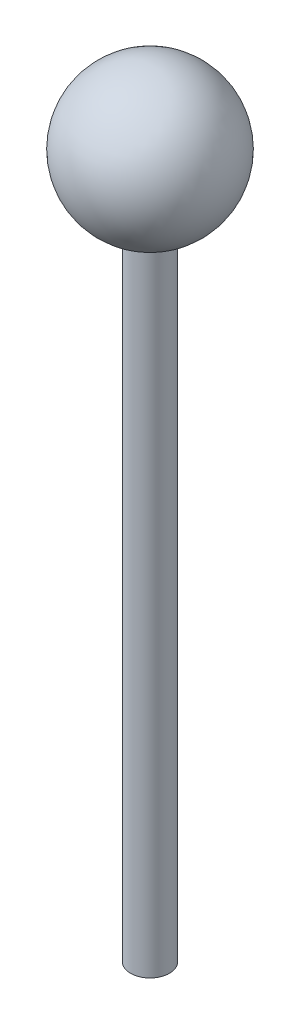
ISO-10303-21;
HEADER;
FILE_DESCRIPTION(('STEP AP214'),'2;1');
FILE_NAME('part.step','',(''),(''),'','','');
FILE_SCHEMA(('AUTOMOTIVE_DESIGN { 1 0 10303 214 1 1 1 1 }'));
ENDSEC;
DATA;
#1=APPLICATION_CONTEXT('core data for automotive mechanical design processes');
#2=APPLICATION_PROTOCOL_DEFINITION('international standard','automotive_design',2000,#1);
#3=PRODUCT_CONTEXT('',#1,'mechanical');
#4=PRODUCT('Part','Part','',(#3));
#5=PRODUCT_RELATED_PRODUCT_CATEGORY('part','',(#4));
#6=PRODUCT_DEFINITION_FORMATION('','',#4);
#7=PRODUCT_DEFINITION_CONTEXT('part definition',#1,'design');
#8=PRODUCT_DEFINITION('design','',#6,#7);
#9=PRODUCT_DEFINITION_SHAPE('','',#8);
#10=(LENGTH_UNIT() NAMED_UNIT(*) SI_UNIT(.MILLI.,.METRE.));
#11=(NAMED_UNIT(*) PLANE_ANGLE_UNIT() SI_UNIT($,.RADIAN.));
#12=(NAMED_UNIT(*) SI_UNIT($,.STERADIAN.) SOLID_ANGLE_UNIT());
#13=UNCERTAINTY_MEASURE_WITH_UNIT(LENGTH_MEASURE(1.E-05),#10,'distance_accuracy_value','');
#14=(GEOMETRIC_REPRESENTATION_CONTEXT(3) GLOBAL_UNCERTAINTY_ASSIGNED_CONTEXT((#13)) GLOBAL_UNIT_ASSIGNED_CONTEXT((#10,
#11,#12)) REPRESENTATION_CONTEXT('',''));
#15=CARTESIAN_POINT('',(0.,0.,0.));
#16=DIRECTION('',(0.,0.,1.));
#17=DIRECTION('',(1.,0.,0.));
#18=AXIS2_PLACEMENT_3D('',#15,#16,#17);
#19=CARTESIAN_POINT('',(0.,65.,0.));
#20=DIRECTION('',(0.,-1.,0.));
#21=DIRECTION('',(0.,0.,-1.));
#22=AXIS2_PLACEMENT_3D('',#19,#20,#21);
#23=CYLINDRICAL_SURFACE('',#22,2.);
#24=CARTESIAN_POINT('',(0.,65.,0.));
#25=DIRECTION('',(0.,1.,0.));
#26=DIRECTION('',(0.,0.,1.));
#27=AXIS2_PLACEMENT_3D('',#24,#25,#26);
#28=CIRCLE('',#27,2.);
#29=CARTESIAN_POINT('',(0.,65.,2.));
#30=VERTEX_POINT('',#29);
#31=EDGE_CURVE('E12',#30,#30,#28,.T.);
#32=ORIENTED_EDGE('',*,*,#31,.F.);
#33=EDGE_LOOP('',(#32));
#34=FACE_BOUND('',#33,.T.);
#35=CARTESIAN_POINT('',(0.,0.,0.));
#36=DIRECTION('',(0.,1.,0.));
#37=DIRECTION('',(0.,0.,1.));
#38=AXIS2_PLACEMENT_3D('',#35,#36,#37);
#39=CIRCLE('',#38,2.);
#40=CARTESIAN_POINT('',(0.,0.,2.));
#41=VERTEX_POINT('',#40);
#42=EDGE_CURVE('E47',#41,#41,#39,.T.);
#43=ORIENTED_EDGE('',*,*,#42,.T.);
#44=EDGE_LOOP('',(#43));
#45=FACE_BOUND('',#44,.T.);
#46=ADVANCED_FACE('F44',(#34,#45),#23,.T.);
#47=CARTESIAN_POINT('',(0.,0.,0.));
#48=DIRECTION('',(0.,1.,0.));
#49=DIRECTION('',(0.,0.,1.));
#50=AXIS2_PLACEMENT_3D('',#47,#48,#49);
#51=PLANE('',#50);
#52=ORIENTED_EDGE('',*,*,#42,.F.);
#53=EDGE_LOOP('',(#52));
#54=FACE_BOUND('',#53,.T.);
#55=ADVANCED_FACE('F57',(#54),#51,.F.);
#56=CARTESIAN_POINT('',(0.,72.2284161474005,0.));
#57=DIRECTION('',(0.,-1.,0.));
#58=DIRECTION('',(-1.,0.,0.));
#59=AXIS2_PLACEMENT_3D('',#56,#57,#58);
#60=SPHERICAL_SURFACE('',#59,7.5);
#61=ORIENTED_EDGE('',*,*,#31,.T.);
#62=EDGE_LOOP('',(#61));
#63=FACE_BOUND('',#62,.T.);
#64=ADVANCED_FACE('F59',(#63),#60,.T.);
#65=CLOSED_SHELL('',(#46,#55,#64));
#66=MANIFOLD_SOLID_BREP('B2',#65);
#67=ADVANCED_BREP_SHAPE_REPRESENTATION('',(#18,#66),#14);
#68=SHAPE_DEFINITION_REPRESENTATION(#9,#67);
ENDSEC;
END-ISO-10303-21;
